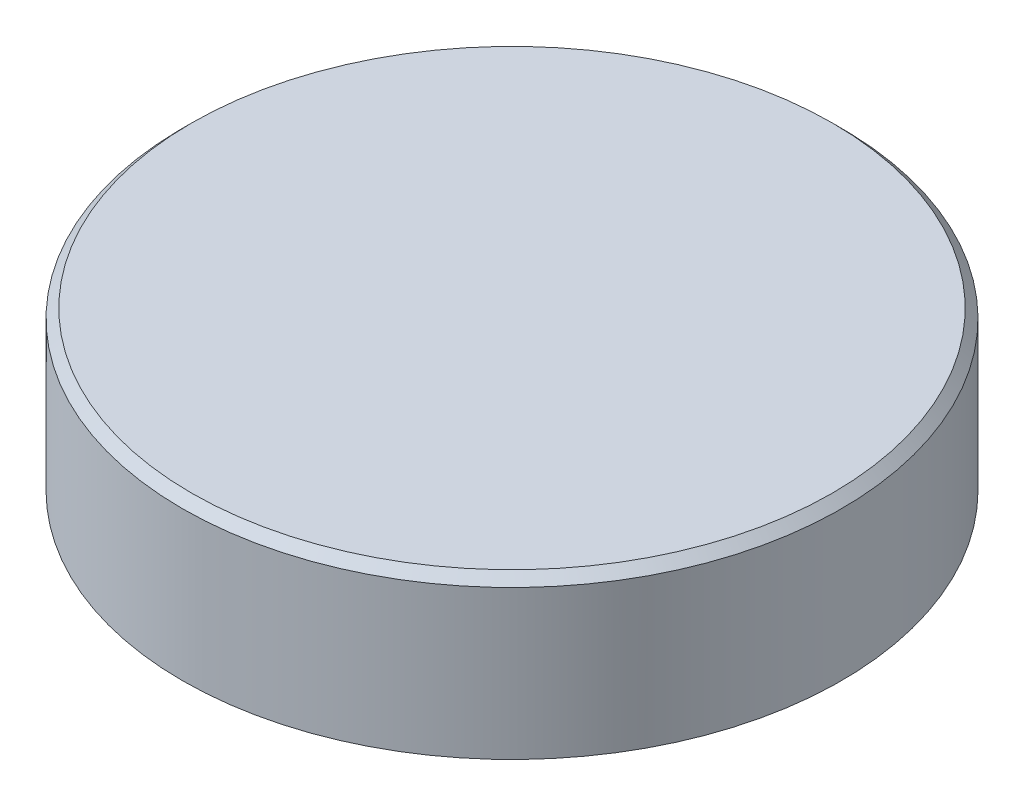
ISO-10303-21;
HEADER;
FILE_DESCRIPTION(('STEP AP214'),'2;1');
FILE_NAME('part.step','',(''),(''),'','','');
FILE_SCHEMA(('AUTOMOTIVE_DESIGN { 1 0 10303 214 1 1 1 1 }'));
ENDSEC;
DATA;
#1=APPLICATION_CONTEXT('core data for automotive mechanical design processes');
#2=APPLICATION_PROTOCOL_DEFINITION('international standard','automotive_design',2000,#1);
#3=PRODUCT_CONTEXT('',#1,'mechanical');
#4=PRODUCT('Part','Part','',(#3));
#5=PRODUCT_RELATED_PRODUCT_CATEGORY('part','',(#4));
#6=PRODUCT_DEFINITION_FORMATION('','',#4);
#7=PRODUCT_DEFINITION_CONTEXT('part definition',#1,'design');
#8=PRODUCT_DEFINITION('design','',#6,#7);
#9=PRODUCT_DEFINITION_SHAPE('','',#8);
#10=(LENGTH_UNIT() NAMED_UNIT(*) SI_UNIT(.MILLI.,.METRE.));
#11=(NAMED_UNIT(*) PLANE_ANGLE_UNIT() SI_UNIT($,.RADIAN.));
#12=(NAMED_UNIT(*) SI_UNIT($,.STERADIAN.) SOLID_ANGLE_UNIT());
#13=UNCERTAINTY_MEASURE_WITH_UNIT(LENGTH_MEASURE(1.E-05),#10,'distance_accuracy_value','');
#14=(GEOMETRIC_REPRESENTATION_CONTEXT(3) GLOBAL_UNCERTAINTY_ASSIGNED_CONTEXT((#13)) GLOBAL_UNIT_ASSIGNED_CONTEXT((#10,
#11,#12)) REPRESENTATION_CONTEXT('',''));
#15=CARTESIAN_POINT('',(0.,0.,0.));
#16=DIRECTION('',(0.,0.,1.));
#17=DIRECTION('',(1.,0.,0.));
#18=AXIS2_PLACEMENT_3D('',#15,#16,#17);
#19=CARTESIAN_POINT('',(-43.,869.,-1.62382802516848E-13));
#20=DIRECTION('',(0.,-1.,0.));
#21=DIRECTION('',(1.,0.,0.));
#22=AXIS2_PLACEMENT_3D('',#19,#20,#21);
#23=CYLINDRICAL_SURFACE('',#22,73.);
#24=CARTESIAN_POINT('',(-43.,867.,-1.62382802516848E-13));
#25=DIRECTION('',(0.,1.,0.));
#26=DIRECTION('',(0.,0.,1.));
#27=AXIS2_PLACEMENT_3D('',#24,#25,#26);
#28=CIRCLE('',#27,73.);
#29=CARTESIAN_POINT('',(-43.,867.,72.9999999999998));
#30=VERTEX_POINT('',#29);
#31=EDGE_CURVE('E10',#30,#30,#28,.F.);
#32=ORIENTED_EDGE('',*,*,#31,.T.);
#33=EDGE_LOOP('',(#32));
#34=FACE_BOUND('',#33,.T.);
#35=CARTESIAN_POINT('',(-43.,834.,-1.62382802516848E-13));
#36=DIRECTION('',(0.,1.,0.));
#37=DIRECTION('',(-1.,0.,0.));
#38=AXIS2_PLACEMENT_3D('',#35,#36,#37);
#39=CIRCLE('',#38,73.);
#40=CARTESIAN_POINT('',(-116.,834.,-1.91048898287272E-13));
#41=VERTEX_POINT('',#40);
#42=EDGE_CURVE('E25',#41,#41,#39,.T.);
#43=ORIENTED_EDGE('',*,*,#42,.T.);
#44=EDGE_LOOP('',(#43));
#45=FACE_BOUND('',#44,.T.);
#46=ADVANCED_FACE('F15',(#34,#45),#23,.T.);
#47=CARTESIAN_POINT('',(-43.,869.,-1.62382802516848E-13));
#48=DIRECTION('',(0.,1.,0.));
#49=DIRECTION('',(-1.,0.,0.));
#50=AXIS2_PLACEMENT_3D('',#47,#48,#49);
#51=PLANE('',#50);
#52=CARTESIAN_POINT('',(-43.,869.,-1.62382802516848E-13));
#53=DIRECTION('',(0.,1.,0.));
#54=DIRECTION('',(0.,0.,1.));
#55=AXIS2_PLACEMENT_3D('',#52,#53,#54);
#56=CIRCLE('',#55,71.);
#57=CARTESIAN_POINT('',(-43.,869.,70.9999999999998));
#58=VERTEX_POINT('',#57);
#59=EDGE_CURVE('E21',#58,#58,#56,.T.);
#60=ORIENTED_EDGE('',*,*,#59,.T.);
#61=EDGE_LOOP('',(#60));
#62=FACE_BOUND('',#61,.T.);
#63=ADVANCED_FACE('F36',(#62),#51,.T.);
#64=CARTESIAN_POINT('',(-43.,834.,-1.62382802516848E-13));
#65=DIRECTION('',(0.,1.,0.));
#66=DIRECTION('',(-1.,0.,0.));
#67=AXIS2_PLACEMENT_3D('',#64,#65,#66);
#68=PLANE('',#67);
#69=ORIENTED_EDGE('',*,*,#42,.F.);
#70=EDGE_LOOP('',(#69));
#71=FACE_BOUND('',#70,.T.);
#72=ADVANCED_FACE('F33',(#71),#68,.F.);
#73=CARTESIAN_POINT('',(-43.,869.,-1.62382802516848E-13));
#74=DIRECTION('',(0.,-1.,0.));
#75=DIRECTION('',(0.,0.,-1.));
#76=AXIS2_PLACEMENT_3D('',#73,#74,#75);
#77=CONICAL_SURFACE('',#76,71.,0.785398163397448);
#78=ORIENTED_EDGE('',*,*,#31,.F.);
#79=EDGE_LOOP('',(#78));
#80=FACE_BOUND('',#79,.T.);
#81=ORIENTED_EDGE('',*,*,#59,.F.);
#82=EDGE_LOOP('',(#81));
#83=FACE_BOUND('',#82,.T.);
#84=ADVANCED_FACE('F35',(#80,#83),#77,.T.);
#85=CLOSED_SHELL('',(#46,#63,#72,#84));
#86=MANIFOLD_SOLID_BREP('B1',#85);
#87=ADVANCED_BREP_SHAPE_REPRESENTATION('',(#18,#86),#14);
#88=SHAPE_DEFINITION_REPRESENTATION(#9,#87);
ENDSEC;
END-ISO-10303-21;
